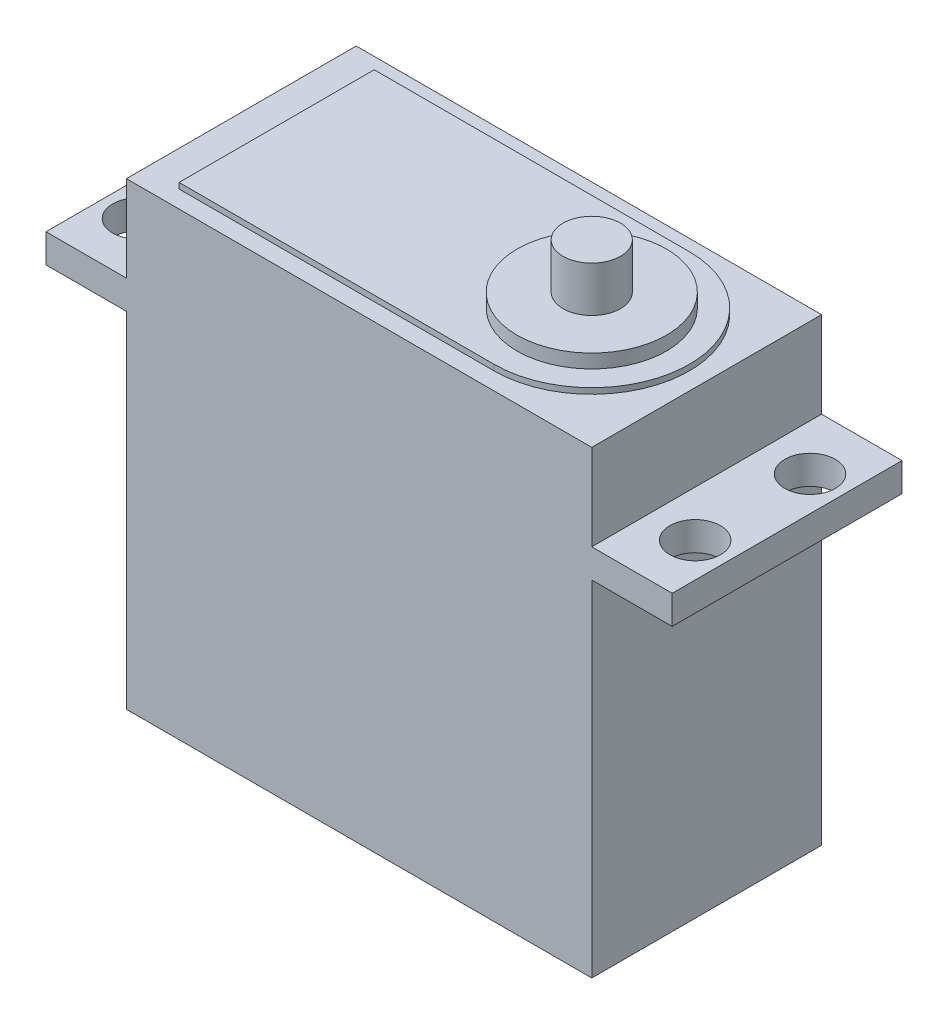
ISO-10303-21;
HEADER;
FILE_DESCRIPTION(('STEP AP214'),'2;1');
FILE_NAME('part.step','',(''),(''),'','','');
FILE_SCHEMA(('AUTOMOTIVE_DESIGN { 1 0 10303 214 1 1 1 1 }'));
ENDSEC;
DATA;
#1=APPLICATION_CONTEXT('core data for automotive mechanical design processes');
#2=APPLICATION_PROTOCOL_DEFINITION('international standard','automotive_design',2000,#1);
#3=PRODUCT_CONTEXT('',#1,'mechanical');
#4=PRODUCT('Part','Part','',(#3));
#5=PRODUCT_RELATED_PRODUCT_CATEGORY('part','',(#4));
#6=PRODUCT_DEFINITION_FORMATION('','',#4);
#7=PRODUCT_DEFINITION_CONTEXT('part definition',#1,'design');
#8=PRODUCT_DEFINITION('design','',#6,#7);
#9=PRODUCT_DEFINITION_SHAPE('','',#8);
#10=(LENGTH_UNIT() NAMED_UNIT(*) SI_UNIT(.MILLI.,.METRE.));
#11=(NAMED_UNIT(*) PLANE_ANGLE_UNIT() SI_UNIT($,.RADIAN.));
#12=(NAMED_UNIT(*) SI_UNIT($,.STERADIAN.) SOLID_ANGLE_UNIT());
#13=UNCERTAINTY_MEASURE_WITH_UNIT(LENGTH_MEASURE(1.E-05),#10,'distance_accuracy_value','');
#14=(GEOMETRIC_REPRESENTATION_CONTEXT(3) GLOBAL_UNCERTAINTY_ASSIGNED_CONTEXT((#13)) GLOBAL_UNIT_ASSIGNED_CONTEXT((#10,
#11,#12)) REPRESENTATION_CONTEXT('',''));
#15=CARTESIAN_POINT('',(0.,0.,0.));
#16=DIRECTION('',(0.,0.,1.));
#17=DIRECTION('',(1.,0.,0.));
#18=AXIS2_PLACEMENT_3D('',#15,#16,#17);
#19=CARTESIAN_POINT('',(0.,32.5,0.));
#20=DIRECTION('',(0.,1.,0.));
#21=DIRECTION('',(0.,0.,1.));
#22=AXIS2_PLACEMENT_3D('',#19,#20,#21);
#23=PLANE('',#22);
#24=CARTESIAN_POINT('',(-4.,32.5,5.00000000000001));
#25=DIRECTION('',(0.,1.,0.));
#26=DIRECTION('',(0.,0.,1.));
#27=AXIS2_PLACEMENT_3D('',#24,#25,#26);
#28=CIRCLE('',#27,2.2);
#29=CARTESIAN_POINT('',(-4.,32.5,7.20000000000001));
#30=VERTEX_POINT('',#29);
#31=EDGE_CURVE('E430',#30,#30,#28,.T.);
#32=ORIENTED_EDGE('',*,*,#31,.F.);
#33=EDGE_LOOP('',(#32));
#34=FACE_BOUND('',#33,.T.);
#35=CARTESIAN_POINT('',(-4.,32.5,15.));
#36=DIRECTION('',(0.,1.,0.));
#37=DIRECTION('',(0.,0.,1.));
#38=AXIS2_PLACEMENT_3D('',#35,#36,#37);
#39=CIRCLE('',#38,2.2);
#40=CARTESIAN_POINT('',(-4.,32.5,17.2));
#41=VERTEX_POINT('',#40);
#42=EDGE_CURVE('E433',#41,#41,#39,.T.);
#43=ORIENTED_EDGE('',*,*,#42,.F.);
#44=EDGE_LOOP('',(#43));
#45=FACE_BOUND('',#44,.T.);
#46=DIRECTION('',(0.,0.,1.));
#47=VECTOR('',#46,1.);
#48=CARTESIAN_POINT('',(0.,32.5,0.));
#49=LINE('',#48,#47);
#50=CARTESIAN_POINT('',(0.,32.5,0.));
#51=VERTEX_POINT('',#50);
#52=CARTESIAN_POINT('',(0.,32.5,20.));
#53=VERTEX_POINT('',#52);
#54=EDGE_CURVE('E185',#51,#53,#49,.T.);
#55=ORIENTED_EDGE('',*,*,#54,.F.);
#56=DIRECTION('',(-1.,0.,0.));
#57=VECTOR('',#56,1.);
#58=CARTESIAN_POINT('',(-7.,32.5,0.));
#59=LINE('',#58,#57);
#60=CARTESIAN_POINT('',(-7.,32.5,0.));
#61=VERTEX_POINT('',#60);
#62=EDGE_CURVE('E241',#51,#61,#59,.T.);
#63=ORIENTED_EDGE('',*,*,#62,.T.);
#64=DIRECTION('',(0.,0.,1.));
#65=VECTOR('',#64,1.);
#66=CARTESIAN_POINT('',(-7.,32.5,0.));
#67=LINE('',#66,#65);
#68=CARTESIAN_POINT('',(-7.,32.5,20.));
#69=VERTEX_POINT('',#68);
#70=EDGE_CURVE('E229',#61,#69,#67,.T.);
#71=ORIENTED_EDGE('',*,*,#70,.T.);
#72=DIRECTION('',(1.,0.,0.));
#73=VECTOR('',#72,1.);
#74=CARTESIAN_POINT('',(-7.,32.5,20.));
#75=LINE('',#74,#73);
#76=EDGE_CURVE('E235',#69,#53,#75,.T.);
#77=ORIENTED_EDGE('',*,*,#76,.T.);
#78=EDGE_LOOP('',(#55,#63,#71,#77));
#79=FACE_BOUND('',#78,.T.);
#80=ADVANCED_FACE('F45',(#34,#45,#79),#23,.T.);
#81=CARTESIAN_POINT('',(0.,30.,0.));
#82=DIRECTION('',(1.,0.,0.));
#83=DIRECTION('',(0.,0.,-1.));
#84=AXIS2_PLACEMENT_3D('',#81,#82,#83);
#85=PLANE('',#84);
#86=DIRECTION('',(0.,0.,1.));
#87=VECTOR('',#86,1.);
#88=CARTESIAN_POINT('',(0.,0.,0.));
#89=LINE('',#88,#87);
#90=CARTESIAN_POINT('',(0.,0.,0.));
#91=VERTEX_POINT('',#90);
#92=CARTESIAN_POINT('',(0.,0.,20.));
#93=VERTEX_POINT('',#92);
#94=EDGE_CURVE('E276',#91,#93,#89,.T.);
#95=ORIENTED_EDGE('',*,*,#94,.T.);
#96=DIRECTION('',(0.,-1.,0.));
#97=VECTOR('',#96,1.);
#98=CARTESIAN_POINT('',(0.,30.,20.));
#99=LINE('',#98,#97);
#100=CARTESIAN_POINT('',(0.,30.,20.));
#101=VERTEX_POINT('',#100);
#102=EDGE_CURVE('E55',#101,#93,#99,.T.);
#103=ORIENTED_EDGE('',*,*,#102,.F.);
#104=DIRECTION('',(0.,0.,1.));
#105=VECTOR('',#104,1.);
#106=CARTESIAN_POINT('',(0.,30.,0.));
#107=LINE('',#106,#105);
#108=CARTESIAN_POINT('',(0.,30.,0.));
#109=VERTEX_POINT('',#108);
#110=EDGE_CURVE('E277',#109,#101,#107,.T.);
#111=ORIENTED_EDGE('',*,*,#110,.F.);
#112=DIRECTION('',(0.,-1.,0.));
#113=VECTOR('',#112,1.);
#114=CARTESIAN_POINT('',(0.,30.,0.));
#115=LINE('',#114,#113);
#116=EDGE_CURVE('E286',#109,#91,#115,.T.);
#117=ORIENTED_EDGE('',*,*,#116,.T.);
#118=EDGE_LOOP('',(#95,#103,#111,#117));
#119=FACE_BOUND('',#118,.T.);
#120=ADVANCED_FACE('F47',(#119),#85,.F.);
#121=CARTESIAN_POINT('',(0.,30.,20.));
#122=DIRECTION('',(0.,0.,-1.));
#123=DIRECTION('',(-1.,0.,0.));
#124=AXIS2_PLACEMENT_3D('',#121,#122,#123);
#125=PLANE('',#124);
#126=DIRECTION('',(1.,0.,0.));
#127=VECTOR('',#126,1.);
#128=CARTESIAN_POINT('',(0.,0.,20.));
#129=LINE('',#128,#127);
#130=CARTESIAN_POINT('',(40.5,0.,20.));
#131=VERTEX_POINT('',#130);
#132=EDGE_CURVE('E290',#93,#131,#129,.T.);
#133=ORIENTED_EDGE('',*,*,#132,.T.);
#134=DIRECTION('',(0.,-1.,0.));
#135=VECTOR('',#134,1.);
#136=CARTESIAN_POINT('',(40.5,30.,20.));
#137=LINE('',#136,#135);
#138=CARTESIAN_POINT('',(40.5,30.,20.));
#139=VERTEX_POINT('',#138);
#140=EDGE_CURVE('E305',#139,#131,#137,.T.);
#141=ORIENTED_EDGE('',*,*,#140,.F.);
#142=DIRECTION('',(1.,0.,0.));
#143=VECTOR('',#142,1.);
#144=CARTESIAN_POINT('',(-7.,30.,20.));
#145=LINE('',#144,#143);
#146=CARTESIAN_POINT('',(47.5,30.,20.));
#147=VERTEX_POINT('',#146);
#148=EDGE_CURVE('E249',#139,#147,#145,.T.);
#149=ORIENTED_EDGE('',*,*,#148,.T.);
#150=DIRECTION('',(0.,-1.,0.));
#151=VECTOR('',#150,1.);
#152=CARTESIAN_POINT('',(47.5,32.5,20.));
#153=LINE('',#152,#151);
#154=CARTESIAN_POINT('',(47.5,32.5,20.));
#155=VERTEX_POINT('',#154);
#156=EDGE_CURVE('E268',#155,#147,#153,.T.);
#157=ORIENTED_EDGE('',*,*,#156,.F.);
#158=CARTESIAN_POINT('',(40.5,32.5,20.));
#159=VERTEX_POINT('',#158);
#160=EDGE_CURVE('E233',#159,#155,#75,.T.);
#161=ORIENTED_EDGE('',*,*,#160,.F.);
#162=DIRECTION('',(0.,-1.,0.));
#163=VECTOR('',#162,1.);
#164=CARTESIAN_POINT('',(40.5,40.,20.));
#165=LINE('',#164,#163);
#166=CARTESIAN_POINT('',(40.5,40.,20.));
#167=VERTEX_POINT('',#166);
#168=EDGE_CURVE('E220',#167,#159,#165,.T.);
#169=ORIENTED_EDGE('',*,*,#168,.F.);
#170=DIRECTION('',(1.,0.,0.));
#171=VECTOR('',#170,1.);
#172=CARTESIAN_POINT('',(0.,40.,20.));
#173=LINE('',#172,#171);
#174=CARTESIAN_POINT('',(0.,40.,20.));
#175=VERTEX_POINT('',#174);
#176=EDGE_CURVE('E200',#175,#167,#173,.T.);
#177=ORIENTED_EDGE('',*,*,#176,.F.);
#178=DIRECTION('',(0.,-1.,0.));
#179=VECTOR('',#178,1.);
#180=CARTESIAN_POINT('',(0.,40.,20.));
#181=LINE('',#180,#179);
#182=EDGE_CURVE('E224',#175,#53,#181,.T.);
#183=ORIENTED_EDGE('',*,*,#182,.T.);
#184=ORIENTED_EDGE('',*,*,#76,.F.);
#185=DIRECTION('',(0.,-1.,0.));
#186=VECTOR('',#185,1.);
#187=CARTESIAN_POINT('',(-7.,32.5,20.));
#188=LINE('',#187,#186);
#189=CARTESIAN_POINT('',(-7.,30.,20.));
#190=VERTEX_POINT('',#189);
#191=EDGE_CURVE('E272',#69,#190,#188,.T.);
#192=ORIENTED_EDGE('',*,*,#191,.T.);
#193=EDGE_CURVE('E250',#190,#101,#145,.T.);
#194=ORIENTED_EDGE('',*,*,#193,.T.);
#195=ORIENTED_EDGE('',*,*,#102,.T.);
#196=EDGE_LOOP('',(#133,#141,#149,#157,#161,#169,#177,#183,#184,#192,#194,#195));
#197=FACE_BOUND('',#196,.T.);
#198=ADVANCED_FACE('F378',(#197),#125,.F.);
#199=CARTESIAN_POINT('',(40.5,30.,0.));
#200=DIRECTION('',(-1.,0.,0.));
#201=DIRECTION('',(0.,0.,1.));
#202=AXIS2_PLACEMENT_3D('',#199,#200,#201);
#203=PLANE('',#202);
#204=DIRECTION('',(0.,0.,-1.));
#205=VECTOR('',#204,1.);
#206=CARTESIAN_POINT('',(40.5,0.,0.));
#207=LINE('',#206,#205);
#208=CARTESIAN_POINT('',(40.5,0.,0.));
#209=VERTEX_POINT('',#208);
#210=EDGE_CURVE('E293',#131,#209,#207,.T.);
#211=ORIENTED_EDGE('',*,*,#210,.T.);
#212=DIRECTION('',(0.,-1.,0.));
#213=VECTOR('',#212,1.);
#214=CARTESIAN_POINT('',(40.5,30.,0.));
#215=LINE('',#214,#213);
#216=CARTESIAN_POINT('',(40.5,30.,0.));
#217=VERTEX_POINT('',#216);
#218=EDGE_CURVE('E301',#217,#209,#215,.T.);
#219=ORIENTED_EDGE('',*,*,#218,.F.);
#220=DIRECTION('',(0.,0.,-1.));
#221=VECTOR('',#220,1.);
#222=CARTESIAN_POINT('',(40.5,30.,0.));
#223=LINE('',#222,#221);
#224=EDGE_CURVE('E281',#139,#217,#223,.T.);
#225=ORIENTED_EDGE('',*,*,#224,.F.);
#226=ORIENTED_EDGE('',*,*,#140,.T.);
#227=EDGE_LOOP('',(#211,#219,#225,#226));
#228=FACE_BOUND('',#227,.T.);
#229=ADVANCED_FACE('F446',(#228),#203,.F.);
#230=CARTESIAN_POINT('',(0.,30.,0.));
#231=DIRECTION('',(0.,0.,1.));
#232=DIRECTION('',(1.,0.,0.));
#233=AXIS2_PLACEMENT_3D('',#230,#231,#232);
#234=PLANE('',#233);
#235=DIRECTION('',(-1.,0.,0.));
#236=VECTOR('',#235,1.);
#237=CARTESIAN_POINT('',(0.,0.,0.));
#238=LINE('',#237,#236);
#239=EDGE_CURVE('E282',#209,#91,#238,.T.);
#240=ORIENTED_EDGE('',*,*,#239,.T.);
#241=ORIENTED_EDGE('',*,*,#116,.F.);
#242=DIRECTION('',(-1.,0.,0.));
#243=VECTOR('',#242,1.);
#244=CARTESIAN_POINT('',(-7.,30.,0.));
#245=LINE('',#244,#243);
#246=CARTESIAN_POINT('',(-7.,30.,0.));
#247=VERTEX_POINT('',#246);
#248=EDGE_CURVE('E257',#109,#247,#245,.T.);
#249=ORIENTED_EDGE('',*,*,#248,.T.);
#250=DIRECTION('',(0.,-1.,0.));
#251=VECTOR('',#250,1.);
#252=CARTESIAN_POINT('',(-7.,32.5,0.));
#253=LINE('',#252,#251);
#254=EDGE_CURVE('E245',#61,#247,#253,.T.);
#255=ORIENTED_EDGE('',*,*,#254,.F.);
#256=ORIENTED_EDGE('',*,*,#62,.F.);
#257=DIRECTION('',(0.,-1.,0.));
#258=VECTOR('',#257,1.);
#259=CARTESIAN_POINT('',(0.,40.,0.));
#260=LINE('',#259,#258);
#261=CARTESIAN_POINT('',(0.,40.,0.));
#262=VERTEX_POINT('',#261);
#263=EDGE_CURVE('E208',#262,#51,#260,.T.);
#264=ORIENTED_EDGE('',*,*,#263,.F.);
#265=DIRECTION('',(-1.,0.,0.));
#266=VECTOR('',#265,1.);
#267=CARTESIAN_POINT('',(0.,40.,0.));
#268=LINE('',#267,#266);
#269=CARTESIAN_POINT('',(40.5,40.,0.));
#270=VERTEX_POINT('',#269);
#271=EDGE_CURVE('E206',#270,#262,#268,.T.);
#272=ORIENTED_EDGE('',*,*,#271,.F.);
#273=DIRECTION('',(0.,-1.,0.));
#274=VECTOR('',#273,1.);
#275=CARTESIAN_POINT('',(40.5,40.,0.));
#276=LINE('',#275,#274);
#277=CARTESIAN_POINT('',(40.5,32.5,0.));
#278=VERTEX_POINT('',#277);
#279=EDGE_CURVE('E216',#270,#278,#276,.T.);
#280=ORIENTED_EDGE('',*,*,#279,.T.);
#281=CARTESIAN_POINT('',(47.5,32.5,0.));
#282=VERTEX_POINT('',#281);
#283=EDGE_CURVE('E242',#282,#278,#59,.T.);
#284=ORIENTED_EDGE('',*,*,#283,.F.);
#285=DIRECTION('',(0.,-1.,0.));
#286=VECTOR('',#285,1.);
#287=CARTESIAN_POINT('',(47.5,32.5,0.));
#288=LINE('',#287,#286);
#289=CARTESIAN_POINT('',(47.5,30.,0.));
#290=VERTEX_POINT('',#289);
#291=EDGE_CURVE('E264',#282,#290,#288,.T.);
#292=ORIENTED_EDGE('',*,*,#291,.T.);
#293=EDGE_CURVE('E234',#290,#217,#245,.T.);
#294=ORIENTED_EDGE('',*,*,#293,.T.);
#295=ORIENTED_EDGE('',*,*,#218,.T.);
#296=EDGE_LOOP('',(#240,#241,#249,#255,#256,#264,#272,#280,#284,#292,#294,#295));
#297=FACE_BOUND('',#296,.T.);
#298=ADVANCED_FACE('F386',(#297),#234,.F.);
#299=CARTESIAN_POINT('',(0.,0.,0.));
#300=DIRECTION('',(0.,1.,0.));
#301=DIRECTION('',(0.,0.,1.));
#302=AXIS2_PLACEMENT_3D('',#299,#300,#301);
#303=PLANE('',#302);
#304=ORIENTED_EDGE('',*,*,#94,.F.);
#305=ORIENTED_EDGE('',*,*,#239,.F.);
#306=ORIENTED_EDGE('',*,*,#210,.F.);
#307=ORIENTED_EDGE('',*,*,#132,.F.);
#308=EDGE_LOOP('',(#304,#305,#306,#307));
#309=FACE_BOUND('',#308,.T.);
#310=ADVANCED_FACE('F443',(#309),#303,.F.);
#311=CARTESIAN_POINT('',(0.,30.,0.));
#312=DIRECTION('',(0.,1.,0.));
#313=DIRECTION('',(0.,0.,1.));
#314=AXIS2_PLACEMENT_3D('',#311,#312,#313);
#315=PLANE('',#314);
#316=CARTESIAN_POINT('',(-4.,30.,5.00000000000001));
#317=DIRECTION('',(0.,1.,0.));
#318=DIRECTION('',(0.,0.,1.));
#319=AXIS2_PLACEMENT_3D('',#316,#317,#318);
#320=CIRCLE('',#319,2.2);
#321=CARTESIAN_POINT('',(-4.,30.,7.20000000000001));
#322=VERTEX_POINT('',#321);
#323=EDGE_CURVE('E49',#322,#322,#320,.T.);
#324=ORIENTED_EDGE('',*,*,#323,.T.);
#325=EDGE_LOOP('',(#324));
#326=FACE_BOUND('',#325,.T.);
#327=CARTESIAN_POINT('',(-4.,30.,15.));
#328=DIRECTION('',(0.,1.,0.));
#329=DIRECTION('',(0.,0.,1.));
#330=AXIS2_PLACEMENT_3D('',#327,#328,#329);
#331=CIRCLE('',#330,2.2);
#332=CARTESIAN_POINT('',(-4.,30.,17.2));
#333=VERTEX_POINT('',#332);
#334=EDGE_CURVE('E311',#333,#333,#331,.T.);
#335=ORIENTED_EDGE('',*,*,#334,.T.);
#336=EDGE_LOOP('',(#335));
#337=FACE_BOUND('',#336,.T.);
#338=ORIENTED_EDGE('',*,*,#248,.F.);
#339=ORIENTED_EDGE('',*,*,#110,.T.);
#340=ORIENTED_EDGE('',*,*,#193,.F.);
#341=DIRECTION('',(0.,0.,1.));
#342=VECTOR('',#341,1.);
#343=CARTESIAN_POINT('',(-7.,30.,0.));
#344=LINE('',#343,#342);
#345=EDGE_CURVE('E228',#247,#190,#344,.T.);
#346=ORIENTED_EDGE('',*,*,#345,.F.);
#347=EDGE_LOOP('',(#338,#339,#340,#346));
#348=FACE_BOUND('',#347,.T.);
#349=ADVANCED_FACE('F439',(#326,#337,#348),#315,.F.);
#350=CARTESIAN_POINT('',(44.5,30.,15.));
#351=DIRECTION('',(0.,1.,0.));
#352=DIRECTION('',(0.,0.,1.));
#353=AXIS2_PLACEMENT_3D('',#350,#351,#352);
#354=CIRCLE('',#353,2.2);
#355=CARTESIAN_POINT('',(44.5,30.,17.2));
#356=VERTEX_POINT('',#355);
#357=EDGE_CURVE('E314',#356,#356,#354,.T.);
#358=ORIENTED_EDGE('',*,*,#357,.T.);
#359=EDGE_LOOP('',(#358));
#360=FACE_BOUND('',#359,.T.);
#361=CARTESIAN_POINT('',(44.5,30.,5.00000000000001));
#362=DIRECTION('',(0.,1.,0.));
#363=DIRECTION('',(0.,0.,1.));
#364=AXIS2_PLACEMENT_3D('',#361,#362,#363);
#365=CIRCLE('',#364,2.2);
#366=CARTESIAN_POINT('',(44.5,30.,7.2));
#367=VERTEX_POINT('',#366);
#368=EDGE_CURVE('E322',#367,#367,#365,.T.);
#369=ORIENTED_EDGE('',*,*,#368,.T.);
#370=EDGE_LOOP('',(#369));
#371=FACE_BOUND('',#370,.T.);
#372=ORIENTED_EDGE('',*,*,#148,.F.);
#373=ORIENTED_EDGE('',*,*,#224,.T.);
#374=ORIENTED_EDGE('',*,*,#293,.F.);
#375=DIRECTION('',(0.,0.,-1.));
#376=VECTOR('',#375,1.);
#377=CARTESIAN_POINT('',(47.5,30.,0.));
#378=LINE('',#377,#376);
#379=EDGE_CURVE('E254',#147,#290,#378,.T.);
#380=ORIENTED_EDGE('',*,*,#379,.F.);
#381=EDGE_LOOP('',(#372,#373,#374,#380));
#382=FACE_BOUND('',#381,.T.);
#383=ADVANCED_FACE('F404',(#360,#371,#382),#315,.F.);
#384=CARTESIAN_POINT('',(-7.,32.5,0.));
#385=DIRECTION('',(1.,0.,0.));
#386=DIRECTION('',(0.,0.,-1.));
#387=AXIS2_PLACEMENT_3D('',#384,#385,#386);
#388=PLANE('',#387);
#389=ORIENTED_EDGE('',*,*,#345,.T.);
#390=ORIENTED_EDGE('',*,*,#191,.F.);
#391=ORIENTED_EDGE('',*,*,#70,.F.);
#392=ORIENTED_EDGE('',*,*,#254,.T.);
#393=EDGE_LOOP('',(#389,#390,#391,#392));
#394=FACE_BOUND('',#393,.T.);
#395=ADVANCED_FACE('F416',(#394),#388,.F.);
#396=CARTESIAN_POINT('',(47.5,32.5,0.));
#397=DIRECTION('',(-1.,0.,0.));
#398=DIRECTION('',(0.,0.,1.));
#399=AXIS2_PLACEMENT_3D('',#396,#397,#398);
#400=PLANE('',#399);
#401=ORIENTED_EDGE('',*,*,#379,.T.);
#402=ORIENTED_EDGE('',*,*,#291,.F.);
#403=DIRECTION('',(0.,0.,-1.));
#404=VECTOR('',#403,1.);
#405=CARTESIAN_POINT('',(47.5,32.5,0.));
#406=LINE('',#405,#404);
#407=EDGE_CURVE('E238',#155,#282,#406,.T.);
#408=ORIENTED_EDGE('',*,*,#407,.F.);
#409=ORIENTED_EDGE('',*,*,#156,.T.);
#410=EDGE_LOOP('',(#401,#402,#408,#409));
#411=FACE_BOUND('',#410,.T.);
#412=ADVANCED_FACE('F401',(#411),#400,.F.);
#413=CARTESIAN_POINT('',(44.5,32.5,15.));
#414=DIRECTION('',(0.,1.,0.));
#415=DIRECTION('',(0.,0.,1.));
#416=AXIS2_PLACEMENT_3D('',#413,#414,#415);
#417=CIRCLE('',#416,2.2);
#418=CARTESIAN_POINT('',(44.5,32.5,17.2));
#419=VERTEX_POINT('',#418);
#420=EDGE_CURVE('E738',#419,#419,#417,.T.);
#421=ORIENTED_EDGE('',*,*,#420,.F.);
#422=EDGE_LOOP('',(#421));
#423=FACE_BOUND('',#422,.T.);
#424=CARTESIAN_POINT('',(44.5,32.5,5.00000000000001));
#425=DIRECTION('',(0.,1.,0.));
#426=DIRECTION('',(0.,0.,1.));
#427=AXIS2_PLACEMENT_3D('',#424,#425,#426);
#428=CIRCLE('',#427,2.2);
#429=CARTESIAN_POINT('',(44.5,32.5,7.2));
#430=VERTEX_POINT('',#429);
#431=EDGE_CURVE('E328',#430,#430,#428,.T.);
#432=ORIENTED_EDGE('',*,*,#431,.F.);
#433=EDGE_LOOP('',(#432));
#434=FACE_BOUND('',#433,.T.);
#435=DIRECTION('',(0.,0.,-1.));
#436=VECTOR('',#435,1.);
#437=CARTESIAN_POINT('',(40.5,32.5,0.));
#438=LINE('',#437,#436);
#439=EDGE_CURVE('E190',#159,#278,#438,.T.);
#440=ORIENTED_EDGE('',*,*,#439,.F.);
#441=ORIENTED_EDGE('',*,*,#160,.T.);
#442=ORIENTED_EDGE('',*,*,#407,.T.);
#443=ORIENTED_EDGE('',*,*,#283,.T.);
#444=EDGE_LOOP('',(#440,#441,#442,#443));
#445=FACE_BOUND('',#444,.T.);
#446=ADVANCED_FACE('F407',(#423,#434,#445),#23,.T.);
#447=CARTESIAN_POINT('',(0.,40.,0.));
#448=DIRECTION('',(1.,0.,0.));
#449=DIRECTION('',(0.,0.,-1.));
#450=AXIS2_PLACEMENT_3D('',#447,#448,#449);
#451=PLANE('',#450);
#452=ORIENTED_EDGE('',*,*,#54,.T.);
#453=ORIENTED_EDGE('',*,*,#182,.F.);
#454=DIRECTION('',(0.,0.,1.));
#455=VECTOR('',#454,1.);
#456=CARTESIAN_POINT('',(0.,40.,0.));
#457=LINE('',#456,#455);
#458=EDGE_CURVE('E196',#262,#175,#457,.T.);
#459=ORIENTED_EDGE('',*,*,#458,.F.);
#460=ORIENTED_EDGE('',*,*,#263,.T.);
#461=EDGE_LOOP('',(#452,#453,#459,#460));
#462=FACE_BOUND('',#461,.T.);
#463=ADVANCED_FACE('F376',(#462),#451,.F.);
#464=CARTESIAN_POINT('',(40.5,40.,0.));
#465=DIRECTION('',(-1.,0.,0.));
#466=DIRECTION('',(0.,0.,1.));
#467=AXIS2_PLACEMENT_3D('',#464,#465,#466);
#468=PLANE('',#467);
#469=ORIENTED_EDGE('',*,*,#439,.T.);
#470=ORIENTED_EDGE('',*,*,#279,.F.);
#471=DIRECTION('',(0.,0.,-1.));
#472=VECTOR('',#471,1.);
#473=CARTESIAN_POINT('',(40.5,40.,0.));
#474=LINE('',#473,#472);
#475=EDGE_CURVE('E203',#167,#270,#474,.T.);
#476=ORIENTED_EDGE('',*,*,#475,.F.);
#477=ORIENTED_EDGE('',*,*,#168,.T.);
#478=EDGE_LOOP('',(#469,#470,#476,#477));
#479=FACE_BOUND('',#478,.T.);
#480=ADVANCED_FACE('F368',(#479),#468,.F.);
#481=CARTESIAN_POINT('',(0.,40.,0.));
#482=DIRECTION('',(0.,1.,0.));
#483=DIRECTION('',(0.,0.,1.));
#484=AXIS2_PLACEMENT_3D('',#481,#482,#483);
#485=PLANE('',#484);
#486=CARTESIAN_POINT('',(30.5,40.,10.));
#487=DIRECTION('',(0.,1.,0.));
#488=DIRECTION('',(0.,0.,1.));
#489=AXIS2_PLACEMENT_3D('',#486,#487,#488);
#490=CIRCLE('',#489,8.49215161360157);
#491=CARTESIAN_POINT('',(30.5,40.,18.4921516136016));
#492=VERTEX_POINT('',#491);
#493=CARTESIAN_POINT('',(30.5,40.,1.50784838639844));
#494=VERTEX_POINT('',#493);
#495=EDGE_CURVE('E63',#492,#494,#490,.T.);
#496=ORIENTED_EDGE('',*,*,#495,.F.);
#497=DIRECTION('',(-1.,0.,0.));
#498=VECTOR('',#497,1.);
#499=CARTESIAN_POINT('',(0.,40.,18.4921516136016));
#500=LINE('',#499,#498);
#501=CARTESIAN_POINT('',(3.07303072457251,40.,18.4921516136016));
#502=VERTEX_POINT('',#501);
#503=EDGE_CURVE('E68',#492,#502,#500,.T.);
#504=ORIENTED_EDGE('',*,*,#503,.T.);
#505=DIRECTION('',(0.,0.,-1.));
#506=VECTOR('',#505,1.);
#507=CARTESIAN_POINT('',(3.07303072457251,40.,0.));
#508=LINE('',#507,#506);
#509=CARTESIAN_POINT('',(3.07303072457251,40.,1.50784838639844));
#510=VERTEX_POINT('',#509);
#511=EDGE_CURVE('E353',#502,#510,#508,.T.);
#512=ORIENTED_EDGE('',*,*,#511,.T.);
#513=DIRECTION('',(-1.,0.,0.));
#514=VECTOR('',#513,1.);
#515=CARTESIAN_POINT('',(0.,40.,1.50784838639844));
#516=LINE('',#515,#514);
#517=EDGE_CURVE('E350',#494,#510,#516,.T.);
#518=ORIENTED_EDGE('',*,*,#517,.F.);
#519=EDGE_LOOP('',(#496,#504,#512,#518));
#520=FACE_BOUND('',#519,.T.);
#521=ORIENTED_EDGE('',*,*,#458,.T.);
#522=ORIENTED_EDGE('',*,*,#176,.T.);
#523=ORIENTED_EDGE('',*,*,#475,.T.);
#524=ORIENTED_EDGE('',*,*,#271,.T.);
#525=EDGE_LOOP('',(#521,#522,#523,#524));
#526=FACE_BOUND('',#525,.T.);
#527=ADVANCED_FACE('F365',(#520,#526),#485,.T.);
#528=CARTESIAN_POINT('',(30.5,40.5,10.));
#529=DIRECTION('',(0.,-1.,0.));
#530=DIRECTION('',(0.,0.,-1.));
#531=AXIS2_PLACEMENT_3D('',#528,#529,#530);
#532=CYLINDRICAL_SURFACE('',#531,8.49215161360157);
#533=ORIENTED_EDGE('',*,*,#495,.T.);
#534=DIRECTION('',(0.,-1.,0.));
#535=VECTOR('',#534,1.);
#536=CARTESIAN_POINT('',(30.5,40.5,1.50784838639844));
#537=LINE('',#536,#535);
#538=CARTESIAN_POINT('',(30.5,40.5,1.50784838639844));
#539=VERTEX_POINT('',#538);
#540=EDGE_CURVE('E165',#539,#494,#537,.T.);
#541=ORIENTED_EDGE('',*,*,#540,.F.);
#542=CARTESIAN_POINT('',(30.5,40.5,10.));
#543=DIRECTION('',(0.,1.,0.));
#544=DIRECTION('',(0.,0.,1.));
#545=AXIS2_PLACEMENT_3D('',#542,#543,#544);
#546=CIRCLE('',#545,8.49215161360157);
#547=CARTESIAN_POINT('',(30.5,40.5,18.4921516136016));
#548=VERTEX_POINT('',#547);
#549=EDGE_CURVE('E173',#548,#539,#546,.T.);
#550=ORIENTED_EDGE('',*,*,#549,.F.);
#551=DIRECTION('',(0.,-1.,0.));
#552=VECTOR('',#551,1.);
#553=CARTESIAN_POINT('',(30.5,40.5,18.4921516136016));
#554=LINE('',#553,#552);
#555=EDGE_CURVE('E347',#548,#492,#554,.T.);
#556=ORIENTED_EDGE('',*,*,#555,.T.);
#557=EDGE_LOOP('',(#533,#541,#550,#556));
#558=FACE_BOUND('',#557,.T.);
#559=ADVANCED_FACE('F183',(#558),#532,.T.);
#560=CARTESIAN_POINT('',(0.,40.5,1.50784838639844));
#561=DIRECTION('',(0.,0.,1.));
#562=DIRECTION('',(1.,0.,0.));
#563=AXIS2_PLACEMENT_3D('',#560,#561,#562);
#564=PLANE('',#563);
#565=ORIENTED_EDGE('',*,*,#517,.T.);
#566=DIRECTION('',(0.,-1.,0.));
#567=VECTOR('',#566,1.);
#568=CARTESIAN_POINT('',(3.07303072457251,40.5,1.50784838639844));
#569=LINE('',#568,#567);
#570=CARTESIAN_POINT('',(3.07303072457251,40.5,1.50784838639844));
#571=VERTEX_POINT('',#570);
#572=EDGE_CURVE('E167',#571,#510,#569,.T.);
#573=ORIENTED_EDGE('',*,*,#572,.F.);
#574=DIRECTION('',(-1.,0.,0.));
#575=VECTOR('',#574,1.);
#576=CARTESIAN_POINT('',(0.,40.5,1.50784838639844));
#577=LINE('',#576,#575);
#578=EDGE_CURVE('E160',#539,#571,#577,.T.);
#579=ORIENTED_EDGE('',*,*,#578,.F.);
#580=ORIENTED_EDGE('',*,*,#540,.T.);
#581=EDGE_LOOP('',(#565,#573,#579,#580));
#582=FACE_BOUND('',#581,.T.);
#583=ADVANCED_FACE('F163',(#582),#564,.F.);
#584=CARTESIAN_POINT('',(3.07303072457251,40.5,0.));
#585=DIRECTION('',(-1.,0.,0.));
#586=DIRECTION('',(0.,0.,1.));
#587=AXIS2_PLACEMENT_3D('',#584,#585,#586);
#588=PLANE('',#587);
#589=ORIENTED_EDGE('',*,*,#511,.F.);
#590=DIRECTION('',(0.,-1.,0.));
#591=VECTOR('',#590,1.);
#592=CARTESIAN_POINT('',(3.07303072457251,40.5,18.4921516136016));
#593=LINE('',#592,#591);
#594=CARTESIAN_POINT('',(3.07303072457251,40.5,18.4921516136016));
#595=VERTEX_POINT('',#594);
#596=EDGE_CURVE('E192',#595,#502,#593,.T.);
#597=ORIENTED_EDGE('',*,*,#596,.F.);
#598=DIRECTION('',(0.,0.,-1.));
#599=VECTOR('',#598,1.);
#600=CARTESIAN_POINT('',(3.07303072457251,40.5,0.));
#601=LINE('',#600,#599);
#602=EDGE_CURVE('E172',#595,#571,#601,.T.);
#603=ORIENTED_EDGE('',*,*,#602,.T.);
#604=ORIENTED_EDGE('',*,*,#572,.T.);
#605=EDGE_LOOP('',(#589,#597,#603,#604));
#606=FACE_BOUND('',#605,.T.);
#607=ADVANCED_FACE('F364',(#606),#588,.T.);
#608=CARTESIAN_POINT('',(0.,40.5,18.4921516136016));
#609=DIRECTION('',(0.,0.,1.));
#610=DIRECTION('',(1.,0.,0.));
#611=AXIS2_PLACEMENT_3D('',#608,#609,#610);
#612=PLANE('',#611);
#613=ORIENTED_EDGE('',*,*,#503,.F.);
#614=ORIENTED_EDGE('',*,*,#555,.F.);
#615=DIRECTION('',(-1.,0.,0.));
#616=VECTOR('',#615,1.);
#617=CARTESIAN_POINT('',(0.,40.5,18.4921516136016));
#618=LINE('',#617,#616);
#619=EDGE_CURVE('E179',#548,#595,#618,.T.);
#620=ORIENTED_EDGE('',*,*,#619,.T.);
#621=ORIENTED_EDGE('',*,*,#596,.T.);
#622=EDGE_LOOP('',(#613,#614,#620,#621));
#623=FACE_BOUND('',#622,.T.);
#624=ADVANCED_FACE('F362',(#623),#612,.T.);
#625=CARTESIAN_POINT('',(0.,40.5,0.));
#626=DIRECTION('',(0.,1.,0.));
#627=DIRECTION('',(0.,0.,1.));
#628=AXIS2_PLACEMENT_3D('',#625,#626,#627);
#629=PLANE('',#628);
#630=CARTESIAN_POINT('',(30.5,40.5,10.));
#631=DIRECTION('',(0.,1.,0.));
#632=DIRECTION('',(0.,0.,1.));
#633=AXIS2_PLACEMENT_3D('',#630,#631,#632);
#634=CIRCLE('',#633,6.5);
#635=CARTESIAN_POINT('',(30.5,40.5,16.5));
#636=VERTEX_POINT('',#635);
#637=EDGE_CURVE('E334',#636,#636,#634,.T.);
#638=ORIENTED_EDGE('',*,*,#637,.F.);
#639=EDGE_LOOP('',(#638));
#640=FACE_BOUND('',#639,.T.);
#641=ORIENTED_EDGE('',*,*,#549,.T.);
#642=ORIENTED_EDGE('',*,*,#578,.T.);
#643=ORIENTED_EDGE('',*,*,#602,.F.);
#644=ORIENTED_EDGE('',*,*,#619,.F.);
#645=EDGE_LOOP('',(#641,#642,#643,#644));
#646=FACE_BOUND('',#645,.T.);
#647=ADVANCED_FACE('F177',(#640,#646),#629,.T.);
#648=CARTESIAN_POINT('',(30.5,41.7,10.));
#649=DIRECTION('',(0.,-1.,0.));
#650=DIRECTION('',(0.,0.,-1.));
#651=AXIS2_PLACEMENT_3D('',#648,#649,#650);
#652=CYLINDRICAL_SURFACE('',#651,6.5);
#653=CARTESIAN_POINT('',(30.5,41.7,10.));
#654=DIRECTION('',(0.,1.,0.));
#655=DIRECTION('',(0.,0.,1.));
#656=AXIS2_PLACEMENT_3D('',#653,#654,#655);
#657=CIRCLE('',#656,6.5);
#658=CARTESIAN_POINT('',(30.5,41.7,16.5));
#659=VERTEX_POINT('',#658);
#660=EDGE_CURVE('E336',#659,#659,#657,.T.);
#661=ORIENTED_EDGE('',*,*,#660,.F.);
#662=EDGE_LOOP('',(#661));
#663=FACE_BOUND('',#662,.T.);
#664=ORIENTED_EDGE('',*,*,#637,.T.);
#665=EDGE_LOOP('',(#664));
#666=FACE_BOUND('',#665,.T.);
#667=ADVANCED_FACE('F493',(#663,#666),#652,.T.);
#668=CARTESIAN_POINT('',(30.5,41.7,10.));
#669=DIRECTION('',(0.,1.,0.));
#670=DIRECTION('',(0.,0.,1.));
#671=AXIS2_PLACEMENT_3D('',#668,#669,#670);
#672=PLANE('',#671);
#673=CARTESIAN_POINT('',(30.5,41.7,10.));
#674=DIRECTION('',(0.,1.,0.));
#675=DIRECTION('',(0.,0.,1.));
#676=AXIS2_PLACEMENT_3D('',#673,#674,#675);
#677=CIRCLE('',#676,2.5);
#678=CARTESIAN_POINT('',(30.5,41.7,12.5));
#679=VERTEX_POINT('',#678);
#680=EDGE_CURVE('E11',#679,#679,#677,.T.);
#681=ORIENTED_EDGE('',*,*,#680,.F.);
#682=EDGE_LOOP('',(#681));
#683=FACE_BOUND('',#682,.T.);
#684=ORIENTED_EDGE('',*,*,#660,.T.);
#685=EDGE_LOOP('',(#684));
#686=FACE_BOUND('',#685,.T.);
#687=ADVANCED_FACE('F489',(#683,#686),#672,.T.);
#688=CARTESIAN_POINT('',(30.5,45.65,10.));
#689=DIRECTION('',(0.,-1.,0.));
#690=DIRECTION('',(0.,0.,-1.));
#691=AXIS2_PLACEMENT_3D('',#688,#689,#690);
#692=CYLINDRICAL_SURFACE('',#691,2.5);
#693=CARTESIAN_POINT('',(30.5,45.65,10.));
#694=DIRECTION('',(0.,1.,0.));
#695=DIRECTION('',(0.,0.,1.));
#696=AXIS2_PLACEMENT_3D('',#693,#694,#695);
#697=CIRCLE('',#696,2.5);
#698=CARTESIAN_POINT('',(30.5,45.65,12.5));
#699=VERTEX_POINT('',#698);
#700=EDGE_CURVE('E320',#699,#699,#697,.T.);
#701=ORIENTED_EDGE('',*,*,#700,.F.);
#702=EDGE_LOOP('',(#701));
#703=FACE_BOUND('',#702,.T.);
#704=ORIENTED_EDGE('',*,*,#680,.T.);
#705=EDGE_LOOP('',(#704));
#706=FACE_BOUND('',#705,.T.);
#707=ADVANCED_FACE('F485',(#703,#706),#692,.T.);
#708=CARTESIAN_POINT('',(30.5,45.65,10.));
#709=DIRECTION('',(0.,1.,0.));
#710=DIRECTION('',(0.,0.,1.));
#711=AXIS2_PLACEMENT_3D('',#708,#709,#710);
#712=PLANE('',#711);
#713=ORIENTED_EDGE('',*,*,#700,.T.);
#714=EDGE_LOOP('',(#713));
#715=FACE_BOUND('',#714,.T.);
#716=ADVANCED_FACE('F481',(#715),#712,.T.);
#717=CARTESIAN_POINT('',(44.5,28.55,5.00000000000001));
#718=DIRECTION('',(0.,1.,0.));
#719=DIRECTION('',(0.,0.,1.));
#720=AXIS2_PLACEMENT_3D('',#717,#718,#719);
#721=CYLINDRICAL_SURFACE('',#720,2.2);
#722=ORIENTED_EDGE('',*,*,#431,.T.);
#723=EDGE_LOOP('',(#722));
#724=FACE_BOUND('',#723,.T.);
#725=ORIENTED_EDGE('',*,*,#368,.F.);
#726=EDGE_LOOP('',(#725));
#727=FACE_BOUND('',#726,.T.);
#728=ADVANCED_FACE('F478',(#724,#727),#721,.F.);
#729=CARTESIAN_POINT('',(44.5,28.55,15.));
#730=DIRECTION('',(0.,1.,0.));
#731=DIRECTION('',(0.,0.,1.));
#732=AXIS2_PLACEMENT_3D('',#729,#730,#731);
#733=CYLINDRICAL_SURFACE('',#732,2.2);
#734=ORIENTED_EDGE('',*,*,#420,.T.);
#735=EDGE_LOOP('',(#734));
#736=FACE_BOUND('',#735,.T.);
#737=ORIENTED_EDGE('',*,*,#357,.F.);
#738=EDGE_LOOP('',(#737));
#739=FACE_BOUND('',#738,.T.);
#740=ADVANCED_FACE('F473',(#736,#739),#733,.F.);
#741=CARTESIAN_POINT('',(-4.,28.55,15.));
#742=DIRECTION('',(0.,1.,0.));
#743=DIRECTION('',(0.,0.,1.));
#744=AXIS2_PLACEMENT_3D('',#741,#742,#743);
#745=CYLINDRICAL_SURFACE('',#744,2.2);
#746=ORIENTED_EDGE('',*,*,#42,.T.);
#747=EDGE_LOOP('',(#746));
#748=FACE_BOUND('',#747,.T.);
#749=ORIENTED_EDGE('',*,*,#334,.F.);
#750=EDGE_LOOP('',(#749));
#751=FACE_BOUND('',#750,.T.);
#752=ADVANCED_FACE('F467',(#748,#751),#745,.F.);
#753=CARTESIAN_POINT('',(-4.,28.55,5.00000000000001));
#754=DIRECTION('',(0.,1.,0.));
#755=DIRECTION('',(0.,0.,1.));
#756=AXIS2_PLACEMENT_3D('',#753,#754,#755);
#757=CYLINDRICAL_SURFACE('',#756,2.2);
#758=ORIENTED_EDGE('',*,*,#31,.T.);
#759=EDGE_LOOP('',(#758));
#760=FACE_BOUND('',#759,.T.);
#761=ORIENTED_EDGE('',*,*,#323,.F.);
#762=EDGE_LOOP('',(#761));
#763=FACE_BOUND('',#762,.T.);
#764=ADVANCED_FACE('F465',(#760,#763),#757,.F.);
#765=CLOSED_SHELL('',(#80,#120,#198,#229,#298,#310,#349,#383,#395,#412,#446,#463,#480,#527,#559,
#583,#607,#624,#647,#667,#687,#707,#716,#728,#740,#752,#764));
#766=MANIFOLD_SOLID_BREP('B2',#765);
#767=ADVANCED_BREP_SHAPE_REPRESENTATION('',(#18,#766),#14);
#768=SHAPE_DEFINITION_REPRESENTATION(#9,#767);
ENDSEC;
END-ISO-10303-21;
